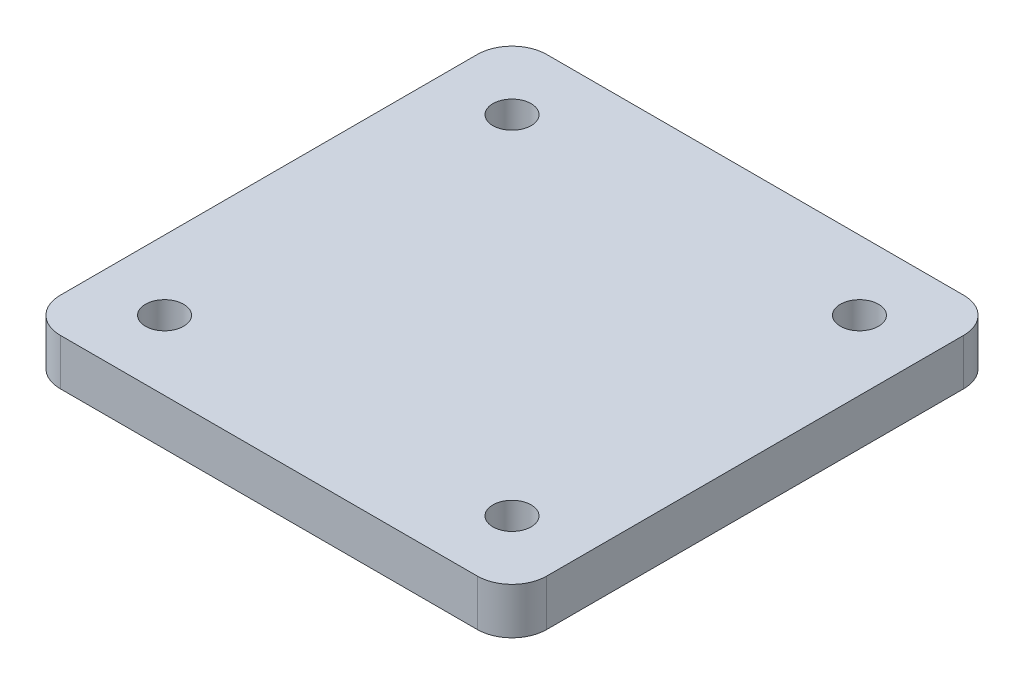
ISO-10303-21;
HEADER;
FILE_DESCRIPTION(('STEP AP214'),'2;1');
FILE_NAME('part.step','',(''),(''),'','','');
FILE_SCHEMA(('AUTOMOTIVE_DESIGN { 1 0 10303 214 1 1 1 1 }'));
ENDSEC;
DATA;
#1=APPLICATION_CONTEXT('core data for automotive mechanical design processes');
#2=APPLICATION_PROTOCOL_DEFINITION('international standard','automotive_design',2000,#1);
#3=PRODUCT_CONTEXT('',#1,'mechanical');
#4=PRODUCT('Part','Part','',(#3));
#5=PRODUCT_RELATED_PRODUCT_CATEGORY('part','',(#4));
#6=PRODUCT_DEFINITION_FORMATION('','',#4);
#7=PRODUCT_DEFINITION_CONTEXT('part definition',#1,'design');
#8=PRODUCT_DEFINITION('design','',#6,#7);
#9=PRODUCT_DEFINITION_SHAPE('','',#8);
#10=(LENGTH_UNIT() NAMED_UNIT(*) SI_UNIT(.MILLI.,.METRE.));
#11=(NAMED_UNIT(*) PLANE_ANGLE_UNIT() SI_UNIT($,.RADIAN.));
#12=(NAMED_UNIT(*) SI_UNIT($,.STERADIAN.) SOLID_ANGLE_UNIT());
#13=UNCERTAINTY_MEASURE_WITH_UNIT(LENGTH_MEASURE(1.E-05),#10,'distance_accuracy_value','');
#14=(GEOMETRIC_REPRESENTATION_CONTEXT(3) GLOBAL_UNCERTAINTY_ASSIGNED_CONTEXT((#13)) GLOBAL_UNIT_ASSIGNED_CONTEXT((#10,
#11,#12)) REPRESENTATION_CONTEXT('',''));
#15=CARTESIAN_POINT('',(0.,0.,0.));
#16=DIRECTION('',(0.,0.,1.));
#17=DIRECTION('',(1.,0.,0.));
#18=AXIS2_PLACEMENT_3D('',#15,#16,#17);
#19=CARTESIAN_POINT('',(0.,4.,42.));
#20=DIRECTION('',(1.,0.,0.));
#21=DIRECTION('',(0.,0.,-1.));
#22=AXIS2_PLACEMENT_3D('',#19,#20,#21);
#23=PLANE('',#22);
#24=DIRECTION('',(0.,0.,-1.));
#25=VECTOR('',#24,1.);
#26=CARTESIAN_POINT('',(0.,4.,42.));
#27=LINE('',#26,#25);
#28=CARTESIAN_POINT('',(0.,4.,39.));
#29=VERTEX_POINT('',#28);
#30=CARTESIAN_POINT('',(0.,4.,3.00000000000002));
#31=VERTEX_POINT('',#30);
#32=EDGE_CURVE('E160',#29,#31,#27,.T.);
#33=ORIENTED_EDGE('',*,*,#32,.T.);
#34=DIRECTION('',(0.,-1.,0.));
#35=VECTOR('',#34,1.);
#36=CARTESIAN_POINT('',(0.,4.,3.));
#37=LINE('',#36,#35);
#38=CARTESIAN_POINT('',(0.,0.,3.00000000000002));
#39=VERTEX_POINT('',#38);
#40=EDGE_CURVE('E124',#31,#39,#37,.T.);
#41=ORIENTED_EDGE('',*,*,#40,.T.);
#42=DIRECTION('',(0.,0.,-1.));
#43=VECTOR('',#42,1.);
#44=CARTESIAN_POINT('',(0.,0.,42.));
#45=LINE('',#44,#43);
#46=CARTESIAN_POINT('',(0.,0.,39.));
#47=VERTEX_POINT('',#46);
#48=EDGE_CURVE('E109',#47,#39,#45,.T.);
#49=ORIENTED_EDGE('',*,*,#48,.F.);
#50=DIRECTION('',(0.,-1.,0.));
#51=VECTOR('',#50,1.);
#52=CARTESIAN_POINT('',(0.,4.,39.));
#53=LINE('',#52,#51);
#54=EDGE_CURVE('E121',#47,#29,#53,.F.);
#55=ORIENTED_EDGE('',*,*,#54,.T.);
#56=EDGE_LOOP('',(#33,#41,#49,#55));
#57=FACE_BOUND('',#56,.T.);
#58=ADVANCED_FACE('F39',(#57),#23,.F.);
#59=CARTESIAN_POINT('',(0.,0.,42.));
#60=DIRECTION('',(0.,1.,0.));
#61=DIRECTION('',(0.,0.,1.));
#62=AXIS2_PLACEMENT_3D('',#59,#60,#61);
#63=PLANE('',#62);
#64=CARTESIAN_POINT('',(36.,0.,36.));
#65=DIRECTION('',(0.,1.,0.));
#66=DIRECTION('',(0.,0.,1.));
#67=AXIS2_PLACEMENT_3D('',#64,#65,#66);
#68=CIRCLE('',#67,1.65);
#69=CARTESIAN_POINT('',(36.,0.,37.65));
#70=VERTEX_POINT('',#69);
#71=EDGE_CURVE('E339',#70,#70,#68,.T.);
#72=ORIENTED_EDGE('',*,*,#71,.T.);
#73=EDGE_LOOP('',(#72));
#74=FACE_BOUND('',#73,.T.);
#75=CARTESIAN_POINT('',(36.,0.,6.));
#76=DIRECTION('',(0.,1.,0.));
#77=DIRECTION('',(0.,0.,1.));
#78=AXIS2_PLACEMENT_3D('',#75,#76,#77);
#79=CIRCLE('',#78,1.65);
#80=CARTESIAN_POINT('',(36.,0.,7.65));
#81=VERTEX_POINT('',#80);
#82=EDGE_CURVE('E347',#81,#81,#79,.T.);
#83=ORIENTED_EDGE('',*,*,#82,.T.);
#84=EDGE_LOOP('',(#83));
#85=FACE_BOUND('',#84,.T.);
#86=CARTESIAN_POINT('',(6.,0.,36.));
#87=DIRECTION('',(0.,1.,0.));
#88=DIRECTION('',(0.,0.,1.));
#89=AXIS2_PLACEMENT_3D('',#86,#87,#88);
#90=CIRCLE('',#89,1.65);
#91=CARTESIAN_POINT('',(6.,0.,37.65));
#92=VERTEX_POINT('',#91);
#93=EDGE_CURVE('E353',#92,#92,#90,.T.);
#94=ORIENTED_EDGE('',*,*,#93,.T.);
#95=EDGE_LOOP('',(#94));
#96=FACE_BOUND('',#95,.T.);
#97=CARTESIAN_POINT('',(6.,0.,6.));
#98=DIRECTION('',(0.,1.,0.));
#99=DIRECTION('',(0.,0.,1.));
#100=AXIS2_PLACEMENT_3D('',#97,#98,#99);
#101=CIRCLE('',#100,1.65);
#102=CARTESIAN_POINT('',(6.,0.,7.65));
#103=VERTEX_POINT('',#102);
#104=EDGE_CURVE('E171',#103,#103,#101,.T.);
#105=ORIENTED_EDGE('',*,*,#104,.T.);
#106=EDGE_LOOP('',(#105));
#107=FACE_BOUND('',#106,.T.);
#108=ORIENTED_EDGE('',*,*,#48,.T.);
#109=CARTESIAN_POINT('',(3.,0.,3.));
#110=DIRECTION('',(0.,1.,0.));
#111=DIRECTION('',(0.,0.,1.));
#112=AXIS2_PLACEMENT_3D('',#109,#110,#111);
#113=CIRCLE('',#112,3.);
#114=CARTESIAN_POINT('',(3.,0.,0.));
#115=VERTEX_POINT('',#114);
#116=EDGE_CURVE('E136',#39,#115,#113,.F.);
#117=ORIENTED_EDGE('',*,*,#116,.T.);
#118=DIRECTION('',(1.,0.,0.));
#119=VECTOR('',#118,1.);
#120=CARTESIAN_POINT('',(0.,0.,0.));
#121=LINE('',#120,#119);
#122=CARTESIAN_POINT('',(39.,0.,0.));
#123=VERTEX_POINT('',#122);
#124=EDGE_CURVE('E168',#115,#123,#121,.T.);
#125=ORIENTED_EDGE('',*,*,#124,.T.);
#126=CARTESIAN_POINT('',(39.,0.,3.));
#127=DIRECTION('',(0.,1.,0.));
#128=DIRECTION('',(0.,0.,1.));
#129=AXIS2_PLACEMENT_3D('',#126,#127,#128);
#130=CIRCLE('',#129,3.);
#131=CARTESIAN_POINT('',(42.,0.,3.00000000000002));
#132=VERTEX_POINT('',#131);
#133=EDGE_CURVE('E115',#123,#132,#130,.F.);
#134=ORIENTED_EDGE('',*,*,#133,.T.);
#135=DIRECTION('',(0.,0.,-1.));
#136=VECTOR('',#135,1.);
#137=CARTESIAN_POINT('',(42.,0.,42.));
#138=LINE('',#137,#136);
#139=CARTESIAN_POINT('',(42.,0.,39.));
#140=VERTEX_POINT('',#139);
#141=EDGE_CURVE('E125',#140,#132,#138,.T.);
#142=ORIENTED_EDGE('',*,*,#141,.F.);
#143=CARTESIAN_POINT('',(39.,0.,39.));
#144=DIRECTION('',(0.,1.,0.));
#145=DIRECTION('',(0.,0.,1.));
#146=AXIS2_PLACEMENT_3D('',#143,#144,#145);
#147=CIRCLE('',#146,3.);
#148=CARTESIAN_POINT('',(39.,0.,42.));
#149=VERTEX_POINT('',#148);
#150=EDGE_CURVE('E116',#140,#149,#147,.F.);
#151=ORIENTED_EDGE('',*,*,#150,.T.);
#152=DIRECTION('',(1.,0.,0.));
#153=VECTOR('',#152,1.);
#154=CARTESIAN_POINT('',(0.,0.,42.));
#155=LINE('',#154,#153);
#156=CARTESIAN_POINT('',(3.,0.,42.));
#157=VERTEX_POINT('',#156);
#158=EDGE_CURVE('E111',#157,#149,#155,.T.);
#159=ORIENTED_EDGE('',*,*,#158,.F.);
#160=CARTESIAN_POINT('',(3.,0.,39.));
#161=DIRECTION('',(0.,1.,0.));
#162=DIRECTION('',(0.,0.,1.));
#163=AXIS2_PLACEMENT_3D('',#160,#161,#162);
#164=CIRCLE('',#163,3.);
#165=EDGE_CURVE('E106',#157,#47,#164,.F.);
#166=ORIENTED_EDGE('',*,*,#165,.T.);
#167=EDGE_LOOP('',(#108,#117,#125,#134,#142,#151,#159,#166));
#168=FACE_BOUND('',#167,.T.);
#169=ADVANCED_FACE('F108',(#74,#85,#96,#107,#168),#63,.F.);
#170=CARTESIAN_POINT('',(42.,0.,42.));
#171=DIRECTION('',(-1.,0.,0.));
#172=DIRECTION('',(0.,0.,1.));
#173=AXIS2_PLACEMENT_3D('',#170,#171,#172);
#174=PLANE('',#173);
#175=ORIENTED_EDGE('',*,*,#141,.T.);
#176=DIRECTION('',(0.,1.,0.));
#177=VECTOR('',#176,1.);
#178=CARTESIAN_POINT('',(42.,0.,3.));
#179=LINE('',#178,#177);
#180=CARTESIAN_POINT('',(42.,4.,3.00000000000002));
#181=VERTEX_POINT('',#180);
#182=EDGE_CURVE('E149',#132,#181,#179,.T.);
#183=ORIENTED_EDGE('',*,*,#182,.T.);
#184=DIRECTION('',(0.,0.,-1.));
#185=VECTOR('',#184,1.);
#186=CARTESIAN_POINT('',(42.,4.,42.));
#187=LINE('',#186,#185);
#188=CARTESIAN_POINT('',(42.,4.,39.));
#189=VERTEX_POINT('',#188);
#190=EDGE_CURVE('E162',#189,#181,#187,.T.);
#191=ORIENTED_EDGE('',*,*,#190,.F.);
#192=DIRECTION('',(0.,1.,0.));
#193=VECTOR('',#192,1.);
#194=CARTESIAN_POINT('',(42.,0.,39.));
#195=LINE('',#194,#193);
#196=EDGE_CURVE('E147',#189,#140,#195,.F.);
#197=ORIENTED_EDGE('',*,*,#196,.T.);
#198=EDGE_LOOP('',(#175,#183,#191,#197));
#199=FACE_BOUND('',#198,.T.);
#200=ADVANCED_FACE('F176',(#199),#174,.F.);
#201=CARTESIAN_POINT('',(42.,4.,42.));
#202=DIRECTION('',(0.,-1.,0.));
#203=DIRECTION('',(0.,0.,-1.));
#204=AXIS2_PLACEMENT_3D('',#201,#202,#203);
#205=PLANE('',#204);
#206=CARTESIAN_POINT('',(36.,4.,36.));
#207=DIRECTION('',(0.,1.,0.));
#208=DIRECTION('',(0.,0.,1.));
#209=AXIS2_PLACEMENT_3D('',#206,#207,#208);
#210=CIRCLE('',#209,1.65);
#211=CARTESIAN_POINT('',(36.,4.,37.65));
#212=VERTEX_POINT('',#211);
#213=EDGE_CURVE('E342',#212,#212,#210,.T.);
#214=ORIENTED_EDGE('',*,*,#213,.F.);
#215=EDGE_LOOP('',(#214));
#216=FACE_BOUND('',#215,.T.);
#217=CARTESIAN_POINT('',(36.,4.,6.));
#218=DIRECTION('',(0.,1.,0.));
#219=DIRECTION('',(0.,0.,1.));
#220=AXIS2_PLACEMENT_3D('',#217,#218,#219);
#221=CIRCLE('',#220,1.65);
#222=CARTESIAN_POINT('',(36.,4.,7.65));
#223=VERTEX_POINT('',#222);
#224=EDGE_CURVE('E344',#223,#223,#221,.T.);
#225=ORIENTED_EDGE('',*,*,#224,.F.);
#226=EDGE_LOOP('',(#225));
#227=FACE_BOUND('',#226,.T.);
#228=CARTESIAN_POINT('',(6.,4.,36.));
#229=DIRECTION('',(0.,1.,0.));
#230=DIRECTION('',(0.,0.,1.));
#231=AXIS2_PLACEMENT_3D('',#228,#229,#230);
#232=CIRCLE('',#231,1.65);
#233=CARTESIAN_POINT('',(6.,4.,37.65));
#234=VERTEX_POINT('',#233);
#235=EDGE_CURVE('E350',#234,#234,#232,.T.);
#236=ORIENTED_EDGE('',*,*,#235,.F.);
#237=EDGE_LOOP('',(#236));
#238=FACE_BOUND('',#237,.T.);
#239=CARTESIAN_POINT('',(6.,4.,6.));
#240=DIRECTION('',(0.,1.,0.));
#241=DIRECTION('',(0.,0.,1.));
#242=AXIS2_PLACEMENT_3D('',#239,#240,#241);
#243=CIRCLE('',#242,1.65);
#244=CARTESIAN_POINT('',(6.,4.,7.65));
#245=VERTEX_POINT('',#244);
#246=EDGE_CURVE('E356',#245,#245,#243,.T.);
#247=ORIENTED_EDGE('',*,*,#246,.F.);
#248=EDGE_LOOP('',(#247));
#249=FACE_BOUND('',#248,.T.);
#250=DIRECTION('',(-1.,0.,0.));
#251=VECTOR('',#250,1.);
#252=CARTESIAN_POINT('',(42.,4.,0.));
#253=LINE('',#252,#251);
#254=CARTESIAN_POINT('',(39.,4.,0.));
#255=VERTEX_POINT('',#254);
#256=CARTESIAN_POINT('',(3.00000000000002,4.,0.));
#257=VERTEX_POINT('',#256);
#258=EDGE_CURVE('E164',#255,#257,#253,.T.);
#259=ORIENTED_EDGE('',*,*,#258,.T.);
#260=CARTESIAN_POINT('',(3.,4.,3.));
#261=DIRECTION('',(0.,-1.,0.));
#262=DIRECTION('',(0.,0.,-1.));
#263=AXIS2_PLACEMENT_3D('',#260,#261,#262);
#264=CIRCLE('',#263,3.);
#265=EDGE_CURVE('E145',#257,#31,#264,.F.);
#266=ORIENTED_EDGE('',*,*,#265,.T.);
#267=ORIENTED_EDGE('',*,*,#32,.F.);
#268=CARTESIAN_POINT('',(3.,4.,39.));
#269=DIRECTION('',(0.,-1.,0.));
#270=DIRECTION('',(0.,0.,-1.));
#271=AXIS2_PLACEMENT_3D('',#268,#269,#270);
#272=CIRCLE('',#271,3.);
#273=CARTESIAN_POINT('',(3.00000000000002,4.,42.));
#274=VERTEX_POINT('',#273);
#275=EDGE_CURVE('E129',#29,#274,#272,.F.);
#276=ORIENTED_EDGE('',*,*,#275,.T.);
#277=DIRECTION('',(-1.,0.,0.));
#278=VECTOR('',#277,1.);
#279=CARTESIAN_POINT('',(42.,4.,42.));
#280=LINE('',#279,#278);
#281=CARTESIAN_POINT('',(39.,4.,42.));
#282=VERTEX_POINT('',#281);
#283=EDGE_CURVE('E155',#282,#274,#280,.T.);
#284=ORIENTED_EDGE('',*,*,#283,.F.);
#285=CARTESIAN_POINT('',(39.,4.,39.));
#286=DIRECTION('',(0.,-1.,0.));
#287=DIRECTION('',(0.,0.,-1.));
#288=AXIS2_PLACEMENT_3D('',#285,#286,#287);
#289=CIRCLE('',#288,3.);
#290=EDGE_CURVE('E62',#282,#189,#289,.F.);
#291=ORIENTED_EDGE('',*,*,#290,.T.);
#292=ORIENTED_EDGE('',*,*,#190,.T.);
#293=CARTESIAN_POINT('',(39.,4.,3.));
#294=DIRECTION('',(0.,-1.,0.));
#295=DIRECTION('',(0.,0.,-1.));
#296=AXIS2_PLACEMENT_3D('',#293,#294,#295);
#297=CIRCLE('',#296,3.);
#298=EDGE_CURVE('E54',#181,#255,#297,.F.);
#299=ORIENTED_EDGE('',*,*,#298,.T.);
#300=EDGE_LOOP('',(#259,#266,#267,#276,#284,#291,#292,#299));
#301=FACE_BOUND('',#300,.T.);
#302=ADVANCED_FACE('F159',(#216,#227,#238,#249,#301),#205,.F.);
#303=CARTESIAN_POINT('',(0.,0.,42.));
#304=DIRECTION('',(0.,0.,1.));
#305=DIRECTION('',(1.,0.,0.));
#306=AXIS2_PLACEMENT_3D('',#303,#304,#305);
#307=PLANE('',#306);
#308=ORIENTED_EDGE('',*,*,#283,.T.);
#309=DIRECTION('',(0.,-1.,0.));
#310=VECTOR('',#309,1.);
#311=CARTESIAN_POINT('',(3.,0.,42.));
#312=LINE('',#311,#310);
#313=EDGE_CURVE('E11',#274,#157,#312,.T.);
#314=ORIENTED_EDGE('',*,*,#313,.T.);
#315=ORIENTED_EDGE('',*,*,#158,.T.);
#316=DIRECTION('',(0.,1.,0.));
#317=VECTOR('',#316,1.);
#318=CARTESIAN_POINT('',(39.,4.,42.));
#319=LINE('',#318,#317);
#320=EDGE_CURVE('E47',#149,#282,#319,.T.);
#321=ORIENTED_EDGE('',*,*,#320,.T.);
#322=EDGE_LOOP('',(#308,#314,#315,#321));
#323=FACE_BOUND('',#322,.T.);
#324=ADVANCED_FACE('F154',(#323),#307,.T.);
#325=CARTESIAN_POINT('',(0.,0.,0.));
#326=DIRECTION('',(0.,0.,1.));
#327=DIRECTION('',(1.,0.,0.));
#328=AXIS2_PLACEMENT_3D('',#325,#326,#327);
#329=PLANE('',#328);
#330=ORIENTED_EDGE('',*,*,#124,.F.);
#331=DIRECTION('',(0.,-1.,0.));
#332=VECTOR('',#331,1.);
#333=CARTESIAN_POINT('',(3.,0.,0.));
#334=LINE('',#333,#332);
#335=EDGE_CURVE('E140',#115,#257,#334,.F.);
#336=ORIENTED_EDGE('',*,*,#335,.T.);
#337=ORIENTED_EDGE('',*,*,#258,.F.);
#338=DIRECTION('',(0.,1.,0.));
#339=VECTOR('',#338,1.);
#340=CARTESIAN_POINT('',(39.,0.,0.));
#341=LINE('',#340,#339);
#342=EDGE_CURVE('E138',#255,#123,#341,.F.);
#343=ORIENTED_EDGE('',*,*,#342,.T.);
#344=EDGE_LOOP('',(#330,#336,#337,#343));
#345=FACE_BOUND('',#344,.T.);
#346=ADVANCED_FACE('F183',(#345),#329,.F.);
#347=CARTESIAN_POINT('',(3.,4.,3.));
#348=DIRECTION('',(0.,-1.,0.));
#349=DIRECTION('',(0.,0.,-1.));
#350=AXIS2_PLACEMENT_3D('',#347,#348,#349);
#351=CYLINDRICAL_SURFACE('',#350,3.);
#352=ORIENTED_EDGE('',*,*,#265,.F.);
#353=ORIENTED_EDGE('',*,*,#335,.F.);
#354=ORIENTED_EDGE('',*,*,#116,.F.);
#355=ORIENTED_EDGE('',*,*,#40,.F.);
#356=EDGE_LOOP('',(#352,#353,#354,#355));
#357=FACE_BOUND('',#356,.T.);
#358=ADVANCED_FACE('F187',(#357),#351,.T.);
#359=CARTESIAN_POINT('',(39.,0.,3.));
#360=DIRECTION('',(0.,1.,0.));
#361=DIRECTION('',(0.,0.,1.));
#362=AXIS2_PLACEMENT_3D('',#359,#360,#361);
#363=CYLINDRICAL_SURFACE('',#362,3.);
#364=ORIENTED_EDGE('',*,*,#133,.F.);
#365=ORIENTED_EDGE('',*,*,#342,.F.);
#366=ORIENTED_EDGE('',*,*,#298,.F.);
#367=ORIENTED_EDGE('',*,*,#182,.F.);
#368=EDGE_LOOP('',(#364,#365,#366,#367));
#369=FACE_BOUND('',#368,.T.);
#370=ADVANCED_FACE('F179',(#369),#363,.T.);
#371=CARTESIAN_POINT('',(3.,0.,39.));
#372=DIRECTION('',(0.,1.,0.));
#373=DIRECTION('',(0.,0.,1.));
#374=AXIS2_PLACEMENT_3D('',#371,#372,#373);
#375=CYLINDRICAL_SURFACE('',#374,3.);
#376=ORIENTED_EDGE('',*,*,#275,.F.);
#377=ORIENTED_EDGE('',*,*,#54,.F.);
#378=ORIENTED_EDGE('',*,*,#165,.F.);
#379=ORIENTED_EDGE('',*,*,#313,.F.);
#380=EDGE_LOOP('',(#376,#377,#378,#379));
#381=FACE_BOUND('',#380,.T.);
#382=ADVANCED_FACE('F128',(#381),#375,.T.);
#383=CARTESIAN_POINT('',(39.,0.,39.));
#384=DIRECTION('',(0.,-1.,0.));
#385=DIRECTION('',(0.,0.,-1.));
#386=AXIS2_PLACEMENT_3D('',#383,#384,#385);
#387=CYLINDRICAL_SURFACE('',#386,3.);
#388=ORIENTED_EDGE('',*,*,#150,.F.);
#389=ORIENTED_EDGE('',*,*,#196,.F.);
#390=ORIENTED_EDGE('',*,*,#290,.F.);
#391=ORIENTED_EDGE('',*,*,#320,.F.);
#392=EDGE_LOOP('',(#388,#389,#390,#391));
#393=FACE_BOUND('',#392,.T.);
#394=ADVANCED_FACE('F41',(#393),#387,.T.);
#395=CARTESIAN_POINT('',(6.,0.,6.));
#396=DIRECTION('',(0.,1.,0.));
#397=DIRECTION('',(0.,0.,1.));
#398=AXIS2_PLACEMENT_3D('',#395,#396,#397);
#399=CYLINDRICAL_SURFACE('',#398,1.65);
#400=ORIENTED_EDGE('',*,*,#104,.F.);
#401=EDGE_LOOP('',(#400));
#402=FACE_BOUND('',#401,.T.);
#403=ORIENTED_EDGE('',*,*,#246,.T.);
#404=EDGE_LOOP('',(#403));
#405=FACE_BOUND('',#404,.T.);
#406=ADVANCED_FACE('F189',(#402,#405),#399,.F.);
#407=CARTESIAN_POINT('',(6.,0.,36.));
#408=DIRECTION('',(0.,1.,0.));
#409=DIRECTION('',(0.,0.,1.));
#410=AXIS2_PLACEMENT_3D('',#407,#408,#409);
#411=CYLINDRICAL_SURFACE('',#410,1.65);
#412=ORIENTED_EDGE('',*,*,#93,.F.);
#413=EDGE_LOOP('',(#412));
#414=FACE_BOUND('',#413,.T.);
#415=ORIENTED_EDGE('',*,*,#235,.T.);
#416=EDGE_LOOP('',(#415));
#417=FACE_BOUND('',#416,.T.);
#418=ADVANCED_FACE('F194',(#414,#417),#411,.F.);
#419=CARTESIAN_POINT('',(36.,0.,6.));
#420=DIRECTION('',(0.,1.,0.));
#421=DIRECTION('',(0.,0.,1.));
#422=AXIS2_PLACEMENT_3D('',#419,#420,#421);
#423=CYLINDRICAL_SURFACE('',#422,1.65);
#424=ORIENTED_EDGE('',*,*,#82,.F.);
#425=EDGE_LOOP('',(#424));
#426=FACE_BOUND('',#425,.T.);
#427=ORIENTED_EDGE('',*,*,#224,.T.);
#428=EDGE_LOOP('',(#427));
#429=FACE_BOUND('',#428,.T.);
#430=ADVANCED_FACE('F240',(#426,#429),#423,.F.);
#431=CARTESIAN_POINT('',(36.,0.,36.));
#432=DIRECTION('',(0.,1.,0.));
#433=DIRECTION('',(0.,0.,1.));
#434=AXIS2_PLACEMENT_3D('',#431,#432,#433);
#435=CYLINDRICAL_SURFACE('',#434,1.65);
#436=ORIENTED_EDGE('',*,*,#71,.F.);
#437=EDGE_LOOP('',(#436));
#438=FACE_BOUND('',#437,.T.);
#439=ORIENTED_EDGE('',*,*,#213,.T.);
#440=EDGE_LOOP('',(#439));
#441=FACE_BOUND('',#440,.T.);
#442=ADVANCED_FACE('F251',(#438,#441),#435,.F.);
#443=CLOSED_SHELL('',(#58,#169,#200,#302,#324,#346,#358,#370,#382,#394,#406,#418,#430,#442));
#444=MANIFOLD_SOLID_BREP('B2',#443);
#445=ADVANCED_BREP_SHAPE_REPRESENTATION('',(#18,#444),#14);
#446=SHAPE_DEFINITION_REPRESENTATION(#9,#445);
ENDSEC;
END-ISO-10303-21;
